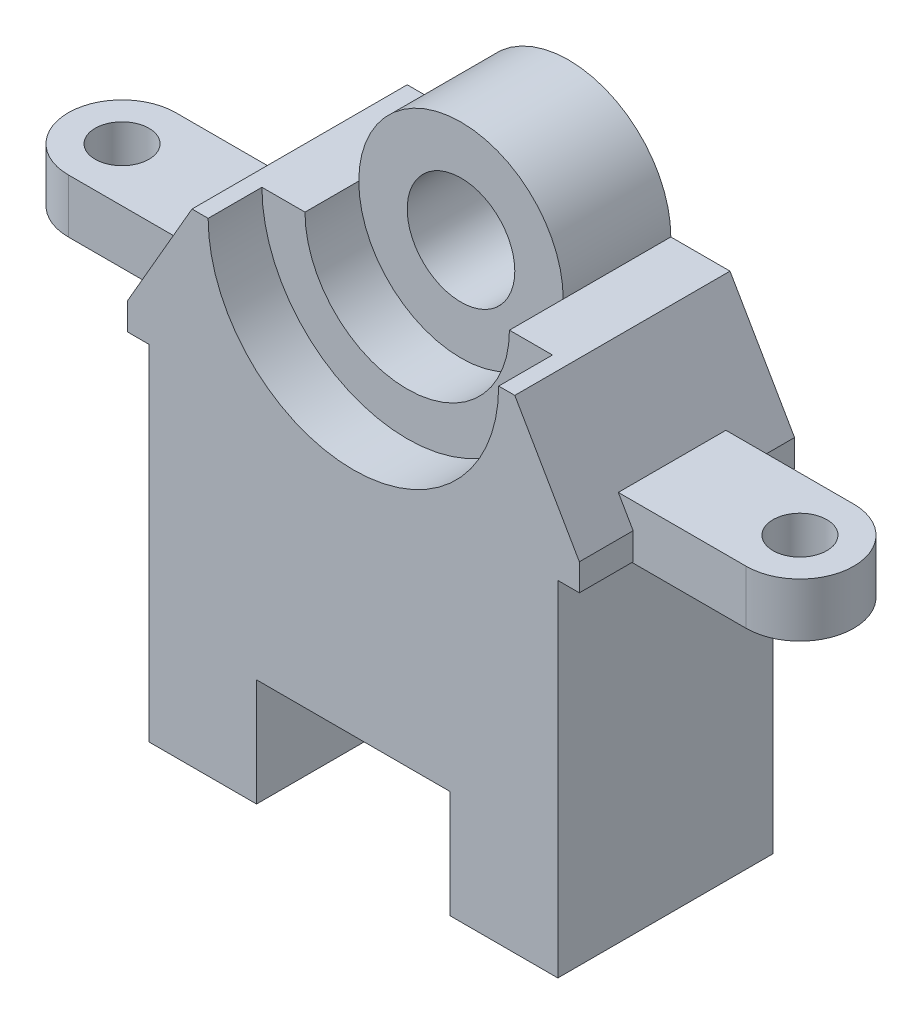
ISO-10303-21;
HEADER;
FILE_DESCRIPTION(('STEP AP214'),'2;1');
FILE_NAME('part.step','',(''),(''),'','','');
FILE_SCHEMA(('AUTOMOTIVE_DESIGN { 1 0 10303 214 1 1 1 1 }'));
ENDSEC;
DATA;
#1=APPLICATION_CONTEXT('core data for automotive mechanical design processes');
#2=APPLICATION_PROTOCOL_DEFINITION('international standard','automotive_design',2000,#1);
#3=PRODUCT_CONTEXT('',#1,'mechanical');
#4=PRODUCT('Part','Part','',(#3));
#5=PRODUCT_RELATED_PRODUCT_CATEGORY('part','',(#4));
#6=PRODUCT_DEFINITION_FORMATION('','',#4);
#7=PRODUCT_DEFINITION_CONTEXT('part definition',#1,'design');
#8=PRODUCT_DEFINITION('design','',#6,#7);
#9=PRODUCT_DEFINITION_SHAPE('','',#8);
#10=(LENGTH_UNIT() NAMED_UNIT(*) SI_UNIT(.MILLI.,.METRE.));
#11=(NAMED_UNIT(*) PLANE_ANGLE_UNIT() SI_UNIT($,.RADIAN.));
#12=(NAMED_UNIT(*) SI_UNIT($,.STERADIAN.) SOLID_ANGLE_UNIT());
#13=UNCERTAINTY_MEASURE_WITH_UNIT(LENGTH_MEASURE(1.E-05),#10,'distance_accuracy_value','');
#14=(GEOMETRIC_REPRESENTATION_CONTEXT(3) GLOBAL_UNCERTAINTY_ASSIGNED_CONTEXT((#13)) GLOBAL_UNIT_ASSIGNED_CONTEXT((#10,
#11,#12)) REPRESENTATION_CONTEXT('',''));
#15=CARTESIAN_POINT('',(0.,0.,0.));
#16=DIRECTION('',(0.,0.,1.));
#17=DIRECTION('',(1.,0.,0.));
#18=AXIS2_PLACEMENT_3D('',#15,#16,#17);
#19=CARTESIAN_POINT('',(-42.,-20.7846096908263,20.));
#20=DIRECTION('',(0.866025403784436,-0.500000000000004,0.));
#21=DIRECTION('',(0.500000000000005,0.866025403784436,0.));
#22=AXIS2_PLACEMENT_3D('',#19,#20,#21);
#23=PLANE('',#22);
#24=DIRECTION('',(0.500000000000005,0.866025403784436,0.));
#25=VECTOR('',#24,1.);
#26=CARTESIAN_POINT('',(-42.,-20.7846096908263,10.));
#27=LINE('',#26,#25);
#28=CARTESIAN_POINT('',(-42.,-20.7846096908263,10.));
#29=VERTEX_POINT('',#28);
#30=CARTESIAN_POINT('',(-39.2376043070341,-16.,10.));
#31=VERTEX_POINT('',#30);
#32=EDGE_CURVE('E293',#29,#31,#27,.T.);
#33=ORIENTED_EDGE('',*,*,#32,.F.);
#34=DIRECTION('',(0.,0.,-1.));
#35=VECTOR('',#34,1.);
#36=CARTESIAN_POINT('',(-42.,-20.7846096908263,20.));
#37=LINE('',#36,#35);
#38=CARTESIAN_POINT('',(-42.,-20.7846096908263,20.));
#39=VERTEX_POINT('',#38);
#40=EDGE_CURVE('E466',#39,#29,#37,.T.);
#41=ORIENTED_EDGE('',*,*,#40,.F.);
#42=DIRECTION('',(-0.500000000000004,-0.866025403784436,0.));
#43=VECTOR('',#42,1.);
#44=CARTESIAN_POINT('',(-42.,-20.7846096908263,20.));
#45=LINE('',#44,#43);
#46=CARTESIAN_POINT('',(-30.,0.,20.));
#47=VERTEX_POINT('',#46);
#48=EDGE_CURVE('E418',#47,#39,#45,.T.);
#49=ORIENTED_EDGE('',*,*,#48,.F.);
#50=DIRECTION('',(0.,0.,-1.));
#51=VECTOR('',#50,1.);
#52=CARTESIAN_POINT('',(-30.,0.,20.));
#53=LINE('',#52,#51);
#54=CARTESIAN_POINT('',(-30.,0.,-20.));
#55=VERTEX_POINT('',#54);
#56=EDGE_CURVE('E469',#47,#55,#53,.T.);
#57=ORIENTED_EDGE('',*,*,#56,.T.);
#58=DIRECTION('',(-0.500000000000004,-0.866025403784436,0.));
#59=VECTOR('',#58,1.);
#60=CARTESIAN_POINT('',(-42.,-20.7846096908263,-20.));
#61=LINE('',#60,#59);
#62=CARTESIAN_POINT('',(-42.,-20.7846096908263,-20.));
#63=VERTEX_POINT('',#62);
#64=EDGE_CURVE('E444',#55,#63,#61,.T.);
#65=ORIENTED_EDGE('',*,*,#64,.T.);
#66=CARTESIAN_POINT('',(-42.,-20.7846096908263,-10.));
#67=VERTEX_POINT('',#66);
#68=EDGE_CURVE('E465',#67,#63,#37,.T.);
#69=ORIENTED_EDGE('',*,*,#68,.F.);
#70=DIRECTION('',(-0.500000000000005,-0.866025403784436,0.));
#71=VECTOR('',#70,1.);
#72=CARTESIAN_POINT('',(-42.,-20.7846096908263,-10.));
#73=LINE('',#72,#71);
#74=CARTESIAN_POINT('',(-39.2376043070341,-16.,-10.));
#75=VERTEX_POINT('',#74);
#76=EDGE_CURVE('E54',#75,#67,#73,.T.);
#77=ORIENTED_EDGE('',*,*,#76,.F.);
#78=DIRECTION('',(0.,0.,1.));
#79=VECTOR('',#78,1.);
#80=CARTESIAN_POINT('',(-39.2376043070341,-16.,20.));
#81=LINE('',#80,#79);
#82=EDGE_CURVE('E11',#75,#31,#81,.T.);
#83=ORIENTED_EDGE('',*,*,#82,.T.);
#84=EDGE_LOOP('',(#33,#41,#49,#57,#65,#69,#77,#83));
#85=FACE_BOUND('',#84,.T.);
#86=ADVANCED_FACE('F35',(#85),#23,.F.);
#87=CARTESIAN_POINT('',(-42.,-25.7846096908263,20.));
#88=DIRECTION('',(1.,0.,0.));
#89=DIRECTION('',(0.,0.,-1.));
#90=AXIS2_PLACEMENT_3D('',#87,#88,#89);
#91=PLANE('',#90);
#92=DIRECTION('',(0.,1.,0.));
#93=VECTOR('',#92,1.);
#94=CARTESIAN_POINT('',(-42.,-25.7846096908263,10.));
#95=LINE('',#94,#93);
#96=CARTESIAN_POINT('',(-42.,-25.7846096908263,10.));
#97=VERTEX_POINT('',#96);
#98=EDGE_CURVE('E290',#97,#29,#95,.T.);
#99=ORIENTED_EDGE('',*,*,#98,.F.);
#100=DIRECTION('',(0.,0.,-1.));
#101=VECTOR('',#100,1.);
#102=CARTESIAN_POINT('',(-42.,-25.7846096908263,20.));
#103=LINE('',#102,#101);
#104=CARTESIAN_POINT('',(-42.,-25.7846096908263,20.));
#105=VERTEX_POINT('',#104);
#106=EDGE_CURVE('E462',#105,#97,#103,.T.);
#107=ORIENTED_EDGE('',*,*,#106,.F.);
#108=DIRECTION('',(0.,-1.,0.));
#109=VECTOR('',#108,1.);
#110=CARTESIAN_POINT('',(-42.,-25.7846096908263,20.));
#111=LINE('',#110,#109);
#112=EDGE_CURVE('E420',#39,#105,#111,.T.);
#113=ORIENTED_EDGE('',*,*,#112,.F.);
#114=ORIENTED_EDGE('',*,*,#40,.T.);
#115=EDGE_LOOP('',(#99,#107,#113,#114));
#116=FACE_BOUND('',#115,.T.);
#117=ADVANCED_FACE('F529',(#116),#91,.F.);
#118=DIRECTION('',(0.,-1.,0.));
#119=VECTOR('',#118,1.);
#120=CARTESIAN_POINT('',(-42.,-25.7846096908263,-10.));
#121=LINE('',#120,#119);
#122=CARTESIAN_POINT('',(-42.,-25.7846096908263,-10.));
#123=VERTEX_POINT('',#122);
#124=EDGE_CURVE('E283',#67,#123,#121,.T.);
#125=ORIENTED_EDGE('',*,*,#124,.F.);
#126=ORIENTED_EDGE('',*,*,#68,.T.);
#127=DIRECTION('',(0.,-1.,0.));
#128=VECTOR('',#127,1.);
#129=CARTESIAN_POINT('',(-42.,-25.7846096908263,-20.));
#130=LINE('',#129,#128);
#131=CARTESIAN_POINT('',(-42.,-25.7846096908263,-20.));
#132=VERTEX_POINT('',#131);
#133=EDGE_CURVE('E447',#63,#132,#130,.T.);
#134=ORIENTED_EDGE('',*,*,#133,.T.);
#135=EDGE_CURVE('E461',#123,#132,#103,.T.);
#136=ORIENTED_EDGE('',*,*,#135,.F.);
#137=EDGE_LOOP('',(#125,#126,#134,#136));
#138=FACE_BOUND('',#137,.T.);
#139=ADVANCED_FACE('F534',(#138),#91,.F.);
#140=CARTESIAN_POINT('',(-38.,-25.7846096908263,20.));
#141=DIRECTION('',(0.,1.,0.));
#142=DIRECTION('',(-1.,0.,0.));
#143=AXIS2_PLACEMENT_3D('',#140,#141,#142);
#144=PLANE('',#143);
#145=DIRECTION('',(-1.,0.,0.));
#146=VECTOR('',#145,1.);
#147=CARTESIAN_POINT('',(-38.,-25.7846096908263,10.));
#148=LINE('',#147,#146);
#149=CARTESIAN_POINT('',(-38.,-25.7846096908263,10.));
#150=VERTEX_POINT('',#149);
#151=EDGE_CURVE('E287',#150,#97,#148,.T.);
#152=ORIENTED_EDGE('',*,*,#151,.F.);
#153=DIRECTION('',(0.,0.,-1.));
#154=VECTOR('',#153,1.);
#155=CARTESIAN_POINT('',(-38.,-25.7846096908263,20.));
#156=LINE('',#155,#154);
#157=CARTESIAN_POINT('',(-38.,-25.7846096908263,20.));
#158=VERTEX_POINT('',#157);
#159=EDGE_CURVE('E458',#158,#150,#156,.T.);
#160=ORIENTED_EDGE('',*,*,#159,.F.);
#161=DIRECTION('',(1.,0.,0.));
#162=VECTOR('',#161,1.);
#163=CARTESIAN_POINT('',(-38.,-25.7846096908263,20.));
#164=LINE('',#163,#162);
#165=EDGE_CURVE('E422',#105,#158,#164,.T.);
#166=ORIENTED_EDGE('',*,*,#165,.F.);
#167=ORIENTED_EDGE('',*,*,#106,.T.);
#168=EDGE_LOOP('',(#152,#160,#166,#167));
#169=FACE_BOUND('',#168,.T.);
#170=ADVANCED_FACE('F670',(#169),#144,.F.);
#171=DIRECTION('',(1.,0.,0.));
#172=VECTOR('',#171,1.);
#173=CARTESIAN_POINT('',(-38.,-25.7846096908263,-10.));
#174=LINE('',#173,#172);
#175=CARTESIAN_POINT('',(-38.,-25.7846096908263,-10.));
#176=VERTEX_POINT('',#175);
#177=EDGE_CURVE('E266',#123,#176,#174,.T.);
#178=ORIENTED_EDGE('',*,*,#177,.F.);
#179=ORIENTED_EDGE('',*,*,#135,.T.);
#180=DIRECTION('',(1.,0.,0.));
#181=VECTOR('',#180,1.);
#182=CARTESIAN_POINT('',(-38.,-25.7846096908263,-20.));
#183=LINE('',#182,#181);
#184=CARTESIAN_POINT('',(-38.,-25.7846096908263,-20.));
#185=VERTEX_POINT('',#184);
#186=EDGE_CURVE('E450',#132,#185,#183,.T.);
#187=ORIENTED_EDGE('',*,*,#186,.T.);
#188=EDGE_CURVE('E457',#176,#185,#156,.T.);
#189=ORIENTED_EDGE('',*,*,#188,.F.);
#190=EDGE_LOOP('',(#178,#179,#187,#189));
#191=FACE_BOUND('',#190,.T.);
#192=ADVANCED_FACE('F669',(#191),#144,.F.);
#193=CARTESIAN_POINT('',(-38.,-89.7846096908263,20.));
#194=DIRECTION('',(1.,0.,0.));
#195=DIRECTION('',(0.,0.,-1.));
#196=AXIS2_PLACEMENT_3D('',#193,#194,#195);
#197=PLANE('',#196);
#198=DIRECTION('',(0.,1.,0.));
#199=VECTOR('',#198,1.);
#200=CARTESIAN_POINT('',(-38.,-89.7846096908263,10.));
#201=LINE('',#200,#199);
#202=CARTESIAN_POINT('',(-38.,-26.,10.));
#203=VERTEX_POINT('',#202);
#204=EDGE_CURVE('E44',#203,#150,#201,.T.);
#205=ORIENTED_EDGE('',*,*,#204,.F.);
#206=DIRECTION('',(0.,0.,1.));
#207=VECTOR('',#206,1.);
#208=CARTESIAN_POINT('',(-38.,-26.,20.));
#209=LINE('',#208,#207);
#210=CARTESIAN_POINT('',(-38.,-26.,-10.));
#211=VERTEX_POINT('',#210);
#212=EDGE_CURVE('E501',#211,#203,#209,.T.);
#213=ORIENTED_EDGE('',*,*,#212,.F.);
#214=DIRECTION('',(0.,-1.,0.));
#215=VECTOR('',#214,1.);
#216=CARTESIAN_POINT('',(-38.,-89.7846096908263,-10.));
#217=LINE('',#216,#215);
#218=EDGE_CURVE('E504',#176,#211,#217,.T.);
#219=ORIENTED_EDGE('',*,*,#218,.F.);
#220=ORIENTED_EDGE('',*,*,#188,.T.);
#221=DIRECTION('',(0.,-1.,0.));
#222=VECTOR('',#221,1.);
#223=CARTESIAN_POINT('',(-38.,-89.7846096908263,-20.));
#224=LINE('',#223,#222);
#225=CARTESIAN_POINT('',(-38.,-89.7846096908263,-20.));
#226=VERTEX_POINT('',#225);
#227=EDGE_CURVE('E453',#185,#226,#224,.T.);
#228=ORIENTED_EDGE('',*,*,#227,.T.);
#229=DIRECTION('',(0.,0.,-1.));
#230=VECTOR('',#229,1.);
#231=CARTESIAN_POINT('',(-38.,-89.7846096908263,20.));
#232=LINE('',#231,#230);
#233=CARTESIAN_POINT('',(-38.,-89.7846096908263,20.));
#234=VERTEX_POINT('',#233);
#235=EDGE_CURVE('E426',#234,#226,#232,.T.);
#236=ORIENTED_EDGE('',*,*,#235,.F.);
#237=DIRECTION('',(0.,-1.,0.));
#238=VECTOR('',#237,1.);
#239=CARTESIAN_POINT('',(-38.,-89.7846096908263,20.));
#240=LINE('',#239,#238);
#241=EDGE_CURVE('E424',#158,#234,#240,.T.);
#242=ORIENTED_EDGE('',*,*,#241,.F.);
#243=ORIENTED_EDGE('',*,*,#159,.T.);
#244=EDGE_LOOP('',(#205,#213,#219,#220,#228,#236,#242,#243));
#245=FACE_BOUND('',#244,.T.);
#246=ADVANCED_FACE('F511',(#245),#197,.F.);
#247=CARTESIAN_POINT('',(38.,-25.7846096908262,20.));
#248=DIRECTION('',(0.,1.,0.));
#249=DIRECTION('',(-1.,0.,0.));
#250=AXIS2_PLACEMENT_3D('',#247,#248,#249);
#251=PLANE('',#250);
#252=DIRECTION('',(0.,0.,-1.));
#253=VECTOR('',#252,1.);
#254=CARTESIAN_POINT('',(38.,-25.7846096908262,20.));
#255=LINE('',#254,#253);
#256=CARTESIAN_POINT('',(38.,-25.7846096908262,20.));
#257=VERTEX_POINT('',#256);
#258=CARTESIAN_POINT('',(38.,-25.7846096908262,10.));
#259=VERTEX_POINT('',#258);
#260=EDGE_CURVE('E484',#257,#259,#255,.T.);
#261=ORIENTED_EDGE('',*,*,#260,.T.);
#262=DIRECTION('',(1.,0.,0.));
#263=VECTOR('',#262,1.);
#264=CARTESIAN_POINT('',(38.,-25.7846096908262,10.));
#265=LINE('',#264,#263);
#266=CARTESIAN_POINT('',(42.,-25.7846096908263,10.));
#267=VERTEX_POINT('',#266);
#268=EDGE_CURVE('E328',#259,#267,#265,.T.);
#269=ORIENTED_EDGE('',*,*,#268,.T.);
#270=DIRECTION('',(0.,0.,-1.));
#271=VECTOR('',#270,1.);
#272=CARTESIAN_POINT('',(42.,-25.7846096908263,20.));
#273=LINE('',#272,#271);
#274=CARTESIAN_POINT('',(42.,-25.7846096908263,20.));
#275=VERTEX_POINT('',#274);
#276=EDGE_CURVE('E480',#275,#267,#273,.T.);
#277=ORIENTED_EDGE('',*,*,#276,.F.);
#278=DIRECTION('',(1.,0.,0.));
#279=VECTOR('',#278,1.);
#280=CARTESIAN_POINT('',(38.,-25.7846096908262,20.));
#281=LINE('',#280,#279);
#282=EDGE_CURVE('E408',#257,#275,#281,.T.);
#283=ORIENTED_EDGE('',*,*,#282,.F.);
#284=EDGE_LOOP('',(#261,#269,#277,#283));
#285=FACE_BOUND('',#284,.T.);
#286=ADVANCED_FACE('F558',(#285),#251,.F.);
#287=CARTESIAN_POINT('',(42.,-25.7846096908263,20.));
#288=DIRECTION('',(-1.,0.,0.));
#289=DIRECTION('',(0.,0.,1.));
#290=AXIS2_PLACEMENT_3D('',#287,#288,#289);
#291=PLANE('',#290);
#292=ORIENTED_EDGE('',*,*,#276,.T.);
#293=DIRECTION('',(0.,1.,0.));
#294=VECTOR('',#293,1.);
#295=CARTESIAN_POINT('',(42.,-25.7846096908263,10.));
#296=LINE('',#295,#294);
#297=CARTESIAN_POINT('',(42.,-20.7846096908263,10.));
#298=VERTEX_POINT('',#297);
#299=EDGE_CURVE('E325',#267,#298,#296,.T.);
#300=ORIENTED_EDGE('',*,*,#299,.T.);
#301=DIRECTION('',(0.,0.,-1.));
#302=VECTOR('',#301,1.);
#303=CARTESIAN_POINT('',(42.,-20.7846096908263,20.));
#304=LINE('',#303,#302);
#305=CARTESIAN_POINT('',(42.,-20.7846096908263,20.));
#306=VERTEX_POINT('',#305);
#307=EDGE_CURVE('E476',#306,#298,#304,.T.);
#308=ORIENTED_EDGE('',*,*,#307,.F.);
#309=DIRECTION('',(0.,1.,0.));
#310=VECTOR('',#309,1.);
#311=CARTESIAN_POINT('',(42.,-25.7846096908263,20.));
#312=LINE('',#311,#310);
#313=EDGE_CURVE('E410',#275,#306,#312,.T.);
#314=ORIENTED_EDGE('',*,*,#313,.F.);
#315=EDGE_LOOP('',(#292,#300,#308,#314));
#316=FACE_BOUND('',#315,.T.);
#317=ADVANCED_FACE('F554',(#316),#291,.F.);
#318=CARTESIAN_POINT('',(-30.,0.,20.));
#319=DIRECTION('',(0.,-1.,0.));
#320=DIRECTION('',(1.,0.,0.));
#321=AXIS2_PLACEMENT_3D('',#318,#319,#320);
#322=PLANE('',#321);
#323=DIRECTION('',(-1.,0.,0.));
#324=VECTOR('',#323,1.);
#325=CARTESIAN_POINT('',(-30.,0.,-20.));
#326=LINE('',#325,#324);
#327=CARTESIAN_POINT('',(30.,0.,-20.));
#328=VERTEX_POINT('',#327);
#329=CARTESIAN_POINT('',(19.,0.,-20.));
#330=VERTEX_POINT('',#329);
#331=EDGE_CURVE('E442',#328,#330,#326,.T.);
#332=ORIENTED_EDGE('',*,*,#331,.T.);
#333=DIRECTION('',(0.,0.,1.));
#334=VECTOR('',#333,1.);
#335=CARTESIAN_POINT('',(19.,0.,-73.7401153701776));
#336=LINE('',#335,#334);
#337=CARTESIAN_POINT('',(19.,0.,0.));
#338=VERTEX_POINT('',#337);
#339=EDGE_CURVE('E349',#330,#338,#336,.T.);
#340=ORIENTED_EDGE('',*,*,#339,.T.);
#341=DIRECTION('',(0.,0.,1.));
#342=VECTOR('',#341,1.);
#343=CARTESIAN_POINT('',(19.,0.,0.));
#344=LINE('',#343,#342);
#345=CARTESIAN_POINT('',(19.,0.,10.));
#346=VERTEX_POINT('',#345);
#347=EDGE_CURVE('E358',#338,#346,#344,.T.);
#348=ORIENTED_EDGE('',*,*,#347,.T.);
#349=DIRECTION('',(1.,0.,0.));
#350=VECTOR('',#349,1.);
#351=CARTESIAN_POINT('',(-27.,0.,10.));
#352=LINE('',#351,#350);
#353=CARTESIAN_POINT('',(27.,0.,10.));
#354=VERTEX_POINT('',#353);
#355=EDGE_CURVE('E365',#346,#354,#352,.T.);
#356=ORIENTED_EDGE('',*,*,#355,.T.);
#357=DIRECTION('',(0.,0.,1.));
#358=VECTOR('',#357,1.);
#359=CARTESIAN_POINT('',(27.,0.,10.));
#360=LINE('',#359,#358);
#361=CARTESIAN_POINT('',(27.,0.,20.));
#362=VERTEX_POINT('',#361);
#363=EDGE_CURVE('E369',#354,#362,#360,.T.);
#364=ORIENTED_EDGE('',*,*,#363,.T.);
#365=DIRECTION('',(-1.,0.,0.));
#366=VECTOR('',#365,1.);
#367=CARTESIAN_POINT('',(-30.,0.,20.));
#368=LINE('',#367,#366);
#369=CARTESIAN_POINT('',(30.,0.,20.));
#370=VERTEX_POINT('',#369);
#371=EDGE_CURVE('E415',#370,#362,#368,.T.);
#372=ORIENTED_EDGE('',*,*,#371,.F.);
#373=DIRECTION('',(0.,0.,-1.));
#374=VECTOR('',#373,1.);
#375=CARTESIAN_POINT('',(30.,0.,20.));
#376=LINE('',#375,#374);
#377=EDGE_CURVE('E472',#370,#328,#376,.T.);
#378=ORIENTED_EDGE('',*,*,#377,.T.);
#379=EDGE_LOOP('',(#332,#340,#348,#356,#364,#372,#378));
#380=FACE_BOUND('',#379,.T.);
#381=ADVANCED_FACE('F545',(#380),#322,.F.);
#382=CARTESIAN_POINT('',(-38.,-89.7846096908263,20.));
#383=DIRECTION('',(0.,1.,0.));
#384=DIRECTION('',(0.,0.,1.));
#385=AXIS2_PLACEMENT_3D('',#382,#383,#384);
#386=PLANE('',#385);
#387=DIRECTION('',(1.,0.,0.));
#388=VECTOR('',#387,1.);
#389=CARTESIAN_POINT('',(-38.,-89.7846096908263,-20.));
#390=LINE('',#389,#388);
#391=CARTESIAN_POINT('',(-18.,-89.7846096908263,-20.));
#392=VERTEX_POINT('',#391);
#393=EDGE_CURVE('E427',#226,#392,#390,.T.);
#394=ORIENTED_EDGE('',*,*,#393,.T.);
#395=DIRECTION('',(0.,0.,1.));
#396=VECTOR('',#395,1.);
#397=CARTESIAN_POINT('',(-18.,-89.7846096908263,-20.));
#398=LINE('',#397,#396);
#399=CARTESIAN_POINT('',(-18.,-89.7846096908263,20.));
#400=VERTEX_POINT('',#399);
#401=EDGE_CURVE('E386',#392,#400,#398,.T.);
#402=ORIENTED_EDGE('',*,*,#401,.T.);
#403=DIRECTION('',(1.,0.,0.));
#404=VECTOR('',#403,1.);
#405=CARTESIAN_POINT('',(-38.,-89.7846096908263,20.));
#406=LINE('',#405,#404);
#407=EDGE_CURVE('E402',#234,#400,#406,.T.);
#408=ORIENTED_EDGE('',*,*,#407,.F.);
#409=ORIENTED_EDGE('',*,*,#235,.T.);
#410=EDGE_LOOP('',(#394,#402,#408,#409));
#411=FACE_BOUND('',#410,.T.);
#412=ADVANCED_FACE('F564',(#411),#386,.F.);
#413=CARTESIAN_POINT('',(18.,-89.7846096908263,20.));
#414=VERTEX_POINT('',#413);
#415=CARTESIAN_POINT('',(38.,-89.7846096908263,20.));
#416=VERTEX_POINT('',#415);
#417=EDGE_CURVE('E406',#414,#416,#406,.T.);
#418=ORIENTED_EDGE('',*,*,#417,.F.);
#419=DIRECTION('',(0.,0.,1.));
#420=VECTOR('',#419,1.);
#421=CARTESIAN_POINT('',(18.,-89.7846096908263,-20.));
#422=LINE('',#421,#420);
#423=CARTESIAN_POINT('',(18.,-89.7846096908263,-20.));
#424=VERTEX_POINT('',#423);
#425=EDGE_CURVE('E398',#424,#414,#422,.T.);
#426=ORIENTED_EDGE('',*,*,#425,.F.);
#427=CARTESIAN_POINT('',(38.,-89.7846096908263,-20.));
#428=VERTEX_POINT('',#427);
#429=EDGE_CURVE('E395',#424,#428,#390,.T.);
#430=ORIENTED_EDGE('',*,*,#429,.T.);
#431=DIRECTION('',(0.,0.,-1.));
#432=VECTOR('',#431,1.);
#433=CARTESIAN_POINT('',(38.,-89.7846096908263,20.));
#434=LINE('',#433,#432);
#435=EDGE_CURVE('E487',#416,#428,#434,.T.);
#436=ORIENTED_EDGE('',*,*,#435,.F.);
#437=EDGE_LOOP('',(#418,#426,#430,#436));
#438=FACE_BOUND('',#437,.T.);
#439=ADVANCED_FACE('F37',(#438),#386,.F.);
#440=CARTESIAN_POINT('',(38.,-89.7846096908263,20.));
#441=DIRECTION('',(-1.,0.,0.));
#442=DIRECTION('',(0.,-1.,0.));
#443=AXIS2_PLACEMENT_3D('',#440,#441,#442);
#444=PLANE('',#443);
#445=DIRECTION('',(0.,0.,-1.));
#446=VECTOR('',#445,1.);
#447=CARTESIAN_POINT('',(38.,-26.,20.));
#448=LINE('',#447,#446);
#449=CARTESIAN_POINT('',(38.,-26.,10.));
#450=VERTEX_POINT('',#449);
#451=CARTESIAN_POINT('',(38.,-26.,-10.));
#452=VERTEX_POINT('',#451);
#453=EDGE_CURVE('E499',#450,#452,#448,.T.);
#454=ORIENTED_EDGE('',*,*,#453,.F.);
#455=DIRECTION('',(0.,1.,0.));
#456=VECTOR('',#455,1.);
#457=CARTESIAN_POINT('',(38.,-89.7846096908263,10.));
#458=LINE('',#457,#456);
#459=EDGE_CURVE('E331',#450,#259,#458,.T.);
#460=ORIENTED_EDGE('',*,*,#459,.T.);
#461=ORIENTED_EDGE('',*,*,#260,.F.);
#462=DIRECTION('',(0.,1.,0.));
#463=VECTOR('',#462,1.);
#464=CARTESIAN_POINT('',(38.,-89.7846096908263,20.));
#465=LINE('',#464,#463);
#466=EDGE_CURVE('E405',#416,#257,#465,.T.);
#467=ORIENTED_EDGE('',*,*,#466,.F.);
#468=ORIENTED_EDGE('',*,*,#435,.T.);
#469=DIRECTION('',(0.,1.,0.));
#470=VECTOR('',#469,1.);
#471=CARTESIAN_POINT('',(38.,-89.7846096908263,-20.));
#472=LINE('',#471,#470);
#473=CARTESIAN_POINT('',(38.,-25.7846096908262,-20.));
#474=VERTEX_POINT('',#473);
#475=EDGE_CURVE('E430',#428,#474,#472,.T.);
#476=ORIENTED_EDGE('',*,*,#475,.T.);
#477=CARTESIAN_POINT('',(38.,-25.7846096908262,-10.));
#478=VERTEX_POINT('',#477);
#479=EDGE_CURVE('E483',#478,#474,#255,.T.);
#480=ORIENTED_EDGE('',*,*,#479,.F.);
#481=DIRECTION('',(0.,-1.,0.));
#482=VECTOR('',#481,1.);
#483=CARTESIAN_POINT('',(38.,-89.7846096908263,-10.));
#484=LINE('',#483,#482);
#485=EDGE_CURVE('E322',#478,#452,#484,.T.);
#486=ORIENTED_EDGE('',*,*,#485,.T.);
#487=EDGE_LOOP('',(#454,#460,#461,#467,#468,#476,#480,#486));
#488=FACE_BOUND('',#487,.T.);
#489=ADVANCED_FACE('F556',(#488),#444,.F.);
#490=CARTESIAN_POINT('',(42.,-25.7846096908263,-10.));
#491=VERTEX_POINT('',#490);
#492=CARTESIAN_POINT('',(42.,-25.7846096908263,-20.));
#493=VERTEX_POINT('',#492);
#494=EDGE_CURVE('E479',#491,#493,#273,.T.);
#495=ORIENTED_EDGE('',*,*,#494,.F.);
#496=DIRECTION('',(-1.,0.,0.));
#497=VECTOR('',#496,1.);
#498=CARTESIAN_POINT('',(38.,-25.7846096908262,-10.));
#499=LINE('',#498,#497);
#500=EDGE_CURVE('E319',#491,#478,#499,.T.);
#501=ORIENTED_EDGE('',*,*,#500,.T.);
#502=ORIENTED_EDGE('',*,*,#479,.T.);
#503=DIRECTION('',(1.,0.,0.));
#504=VECTOR('',#503,1.);
#505=CARTESIAN_POINT('',(38.,-25.7846096908262,-20.));
#506=LINE('',#505,#504);
#507=EDGE_CURVE('E433',#474,#493,#506,.T.);
#508=ORIENTED_EDGE('',*,*,#507,.T.);
#509=EDGE_LOOP('',(#495,#501,#502,#508));
#510=FACE_BOUND('',#509,.T.);
#511=ADVANCED_FACE('F552',(#510),#251,.F.);
#512=CARTESIAN_POINT('',(42.,-20.7846096908263,-10.));
#513=VERTEX_POINT('',#512);
#514=CARTESIAN_POINT('',(42.,-20.7846096908263,-20.));
#515=VERTEX_POINT('',#514);
#516=EDGE_CURVE('E475',#513,#515,#304,.T.);
#517=ORIENTED_EDGE('',*,*,#516,.F.);
#518=DIRECTION('',(0.,-1.,0.));
#519=VECTOR('',#518,1.);
#520=CARTESIAN_POINT('',(42.,-25.7846096908263,-10.));
#521=LINE('',#520,#519);
#522=EDGE_CURVE('E316',#513,#491,#521,.T.);
#523=ORIENTED_EDGE('',*,*,#522,.T.);
#524=ORIENTED_EDGE('',*,*,#494,.T.);
#525=DIRECTION('',(0.,1.,0.));
#526=VECTOR('',#525,1.);
#527=CARTESIAN_POINT('',(42.,-25.7846096908263,-20.));
#528=LINE('',#527,#526);
#529=EDGE_CURVE('E436',#493,#515,#528,.T.);
#530=ORIENTED_EDGE('',*,*,#529,.T.);
#531=EDGE_LOOP('',(#517,#523,#524,#530));
#532=FACE_BOUND('',#531,.T.);
#533=ADVANCED_FACE('F548',(#532),#291,.F.);
#534=CARTESIAN_POINT('',(42.,-20.7846096908263,20.));
#535=DIRECTION('',(-0.866025403784436,-0.500000000000004,0.));
#536=DIRECTION('',(0.500000000000004,-0.866025403784436,0.));
#537=AXIS2_PLACEMENT_3D('',#534,#535,#536);
#538=PLANE('',#537);
#539=ORIENTED_EDGE('',*,*,#307,.T.);
#540=DIRECTION('',(-0.500000000000004,0.866025403784436,0.));
#541=VECTOR('',#540,1.);
#542=CARTESIAN_POINT('',(42.,-20.7846096908263,10.));
#543=LINE('',#542,#541);
#544=CARTESIAN_POINT('',(39.2376043070341,-16.,10.));
#545=VERTEX_POINT('',#544);
#546=EDGE_CURVE('E496',#298,#545,#543,.T.);
#547=ORIENTED_EDGE('',*,*,#546,.T.);
#548=DIRECTION('',(0.,0.,-1.));
#549=VECTOR('',#548,1.);
#550=CARTESIAN_POINT('',(39.2376043070341,-16.,20.));
#551=LINE('',#550,#549);
#552=CARTESIAN_POINT('',(39.2376043070341,-16.,-10.));
#553=VERTEX_POINT('',#552);
#554=EDGE_CURVE('E490',#545,#553,#551,.T.);
#555=ORIENTED_EDGE('',*,*,#554,.T.);
#556=DIRECTION('',(0.500000000000004,-0.866025403784436,0.));
#557=VECTOR('',#556,1.);
#558=CARTESIAN_POINT('',(42.,-20.7846096908263,-10.));
#559=LINE('',#558,#557);
#560=EDGE_CURVE('E493',#553,#513,#559,.T.);
#561=ORIENTED_EDGE('',*,*,#560,.T.);
#562=ORIENTED_EDGE('',*,*,#516,.T.);
#563=DIRECTION('',(-0.500000000000004,0.866025403784436,0.));
#564=VECTOR('',#563,1.);
#565=CARTESIAN_POINT('',(42.,-20.7846096908263,-20.));
#566=LINE('',#565,#564);
#567=EDGE_CURVE('E439',#515,#328,#566,.T.);
#568=ORIENTED_EDGE('',*,*,#567,.T.);
#569=ORIENTED_EDGE('',*,*,#377,.F.);
#570=DIRECTION('',(-0.500000000000004,0.866025403784436,0.));
#571=VECTOR('',#570,1.);
#572=CARTESIAN_POINT('',(42.,-20.7846096908263,20.));
#573=LINE('',#572,#571);
#574=EDGE_CURVE('E412',#306,#370,#573,.T.);
#575=ORIENTED_EDGE('',*,*,#574,.F.);
#576=EDGE_LOOP('',(#539,#547,#555,#561,#562,#568,#569,#575));
#577=FACE_BOUND('',#576,.T.);
#578=ADVANCED_FACE('F543',(#577),#538,.F.);
#579=DIRECTION('',(0.,0.,1.));
#580=VECTOR('',#579,1.);
#581=CARTESIAN_POINT('',(-19.,0.,0.));
#582=LINE('',#581,#580);
#583=CARTESIAN_POINT('',(-19.,0.,0.));
#584=VERTEX_POINT('',#583);
#585=CARTESIAN_POINT('',(-19.,0.,10.));
#586=VERTEX_POINT('',#585);
#587=EDGE_CURVE('E355',#584,#586,#582,.T.);
#588=ORIENTED_EDGE('',*,*,#587,.F.);
#589=DIRECTION('',(0.,0.,1.));
#590=VECTOR('',#589,1.);
#591=CARTESIAN_POINT('',(-19.,0.,-73.7401153701776));
#592=LINE('',#591,#590);
#593=CARTESIAN_POINT('',(-19.,0.,-20.));
#594=VERTEX_POINT('',#593);
#595=EDGE_CURVE('E346',#584,#594,#592,.F.);
#596=ORIENTED_EDGE('',*,*,#595,.T.);
#597=EDGE_CURVE('E441',#594,#55,#326,.T.);
#598=ORIENTED_EDGE('',*,*,#597,.T.);
#599=ORIENTED_EDGE('',*,*,#56,.F.);
#600=CARTESIAN_POINT('',(-27.,0.,20.));
#601=VERTEX_POINT('',#600);
#602=EDGE_CURVE('E414',#601,#47,#368,.T.);
#603=ORIENTED_EDGE('',*,*,#602,.F.);
#604=DIRECTION('',(0.,0.,1.));
#605=VECTOR('',#604,1.);
#606=CARTESIAN_POINT('',(-27.,0.,10.));
#607=LINE('',#606,#605);
#608=CARTESIAN_POINT('',(-27.,0.,10.));
#609=VERTEX_POINT('',#608);
#610=EDGE_CURVE('E371',#609,#601,#607,.T.);
#611=ORIENTED_EDGE('',*,*,#610,.F.);
#612=EDGE_CURVE('E366',#609,#586,#352,.T.);
#613=ORIENTED_EDGE('',*,*,#612,.T.);
#614=EDGE_LOOP('',(#588,#596,#598,#599,#603,#611,#613));
#615=FACE_BOUND('',#614,.T.);
#616=ADVANCED_FACE('F539',(#615),#322,.F.);
#617=CARTESIAN_POINT('',(0.,0.,20.));
#618=DIRECTION('',(0.,0.,1.));
#619=DIRECTION('',(1.,0.,0.));
#620=AXIS2_PLACEMENT_3D('',#617,#618,#619);
#621=PLANE('',#620);
#622=CARTESIAN_POINT('',(0.,0.,20.));
#623=DIRECTION('',(0.,0.,1.));
#624=DIRECTION('',(1.,0.,0.));
#625=AXIS2_PLACEMENT_3D('',#622,#623,#624);
#626=CIRCLE('',#625,27.);
#627=EDGE_CURVE('E361',#601,#362,#626,.T.);
#628=ORIENTED_EDGE('',*,*,#627,.F.);
#629=ORIENTED_EDGE('',*,*,#602,.T.);
#630=ORIENTED_EDGE('',*,*,#48,.T.);
#631=ORIENTED_EDGE('',*,*,#112,.T.);
#632=ORIENTED_EDGE('',*,*,#165,.T.);
#633=ORIENTED_EDGE('',*,*,#241,.T.);
#634=ORIENTED_EDGE('',*,*,#407,.T.);
#635=DIRECTION('',(0.,-1.,0.));
#636=VECTOR('',#635,1.);
#637=CARTESIAN_POINT('',(-18.,-89.7846096908263,20.));
#638=LINE('',#637,#636);
#639=CARTESIAN_POINT('',(-18.,-69.7846096908263,20.));
#640=VERTEX_POINT('',#639);
#641=EDGE_CURVE('E373',#640,#400,#638,.T.);
#642=ORIENTED_EDGE('',*,*,#641,.F.);
#643=DIRECTION('',(-1.,0.,0.));
#644=VECTOR('',#643,1.);
#645=CARTESIAN_POINT('',(-18.,-69.7846096908263,20.));
#646=LINE('',#645,#644);
#647=CARTESIAN_POINT('',(18.,-69.7846096908263,20.));
#648=VERTEX_POINT('',#647);
#649=EDGE_CURVE('E380',#648,#640,#646,.T.);
#650=ORIENTED_EDGE('',*,*,#649,.F.);
#651=DIRECTION('',(0.,1.,0.));
#652=VECTOR('',#651,1.);
#653=CARTESIAN_POINT('',(18.,-89.7846096908263,20.));
#654=LINE('',#653,#652);
#655=EDGE_CURVE('E388',#414,#648,#654,.T.);
#656=ORIENTED_EDGE('',*,*,#655,.F.);
#657=ORIENTED_EDGE('',*,*,#417,.T.);
#658=ORIENTED_EDGE('',*,*,#466,.T.);
#659=ORIENTED_EDGE('',*,*,#282,.T.);
#660=ORIENTED_EDGE('',*,*,#313,.T.);
#661=ORIENTED_EDGE('',*,*,#574,.T.);
#662=ORIENTED_EDGE('',*,*,#371,.T.);
#663=EDGE_LOOP('',(#628,#629,#630,#631,#632,#633,#634,#642,#650,#656,#657,#658,#659,#660,#661,#662));
#664=FACE_BOUND('',#663,.T.);
#665=ADVANCED_FACE('F542',(#664),#621,.T.);
#666=CARTESIAN_POINT('',(0.,0.,-20.));
#667=DIRECTION('',(0.,0.,1.));
#668=DIRECTION('',(1.,0.,0.));
#669=AXIS2_PLACEMENT_3D('',#666,#667,#668);
#670=PLANE('',#669);
#671=CARTESIAN_POINT('',(0.,0.,-20.));
#672=DIRECTION('',(0.,0.,1.));
#673=DIRECTION('',(1.,0.,0.));
#674=AXIS2_PLACEMENT_3D('',#671,#672,#673);
#675=CIRCLE('',#674,10.);
#676=CARTESIAN_POINT('',(10.,0.,-20.));
#677=VERTEX_POINT('',#676);
#678=EDGE_CURVE('E338',#677,#677,#675,.F.);
#679=ORIENTED_EDGE('',*,*,#678,.F.);
#680=EDGE_LOOP('',(#679));
#681=FACE_BOUND('',#680,.T.);
#682=ORIENTED_EDGE('',*,*,#597,.F.);
#683=CARTESIAN_POINT('',(0.,0.,-20.));
#684=DIRECTION('',(0.,0.,1.));
#685=DIRECTION('',(1.,0.,0.));
#686=AXIS2_PLACEMENT_3D('',#683,#684,#685);
#687=CIRCLE('',#686,19.);
#688=EDGE_CURVE('E335',#594,#330,#687,.F.);
#689=ORIENTED_EDGE('',*,*,#688,.T.);
#690=ORIENTED_EDGE('',*,*,#331,.F.);
#691=ORIENTED_EDGE('',*,*,#567,.F.);
#692=ORIENTED_EDGE('',*,*,#529,.F.);
#693=ORIENTED_EDGE('',*,*,#507,.F.);
#694=ORIENTED_EDGE('',*,*,#475,.F.);
#695=ORIENTED_EDGE('',*,*,#429,.F.);
#696=DIRECTION('',(0.,1.,0.));
#697=VECTOR('',#696,1.);
#698=CARTESIAN_POINT('',(18.,-89.7846096908263,-20.));
#699=LINE('',#698,#697);
#700=CARTESIAN_POINT('',(18.,-69.7846096908263,-20.));
#701=VERTEX_POINT('',#700);
#702=EDGE_CURVE('E379',#424,#701,#699,.T.);
#703=ORIENTED_EDGE('',*,*,#702,.T.);
#704=DIRECTION('',(-1.,0.,0.));
#705=VECTOR('',#704,1.);
#706=CARTESIAN_POINT('',(-18.,-69.7846096908263,-20.));
#707=LINE('',#706,#705);
#708=CARTESIAN_POINT('',(-18.,-69.7846096908263,-20.));
#709=VERTEX_POINT('',#708);
#710=EDGE_CURVE('E383',#701,#709,#707,.T.);
#711=ORIENTED_EDGE('',*,*,#710,.T.);
#712=DIRECTION('',(0.,-1.,0.));
#713=VECTOR('',#712,1.);
#714=CARTESIAN_POINT('',(-18.,-89.7846096908263,-20.));
#715=LINE('',#714,#713);
#716=EDGE_CURVE('E376',#709,#392,#715,.T.);
#717=ORIENTED_EDGE('',*,*,#716,.T.);
#718=ORIENTED_EDGE('',*,*,#393,.F.);
#719=ORIENTED_EDGE('',*,*,#227,.F.);
#720=ORIENTED_EDGE('',*,*,#186,.F.);
#721=ORIENTED_EDGE('',*,*,#133,.F.);
#722=ORIENTED_EDGE('',*,*,#64,.F.);
#723=EDGE_LOOP('',(#682,#689,#690,#691,#692,#693,#694,#695,#703,#711,#717,#718,#719,#720,#721,#722));
#724=FACE_BOUND('',#723,.T.);
#725=ADVANCED_FACE('F602',(#681,#724),#670,.F.);
#726=CARTESIAN_POINT('',(-18.,-89.7846096908263,-20.));
#727=DIRECTION('',(-1.,0.,0.));
#728=DIRECTION('',(0.,0.,1.));
#729=AXIS2_PLACEMENT_3D('',#726,#727,#728);
#730=PLANE('',#729);
#731=ORIENTED_EDGE('',*,*,#641,.T.);
#732=ORIENTED_EDGE('',*,*,#401,.F.);
#733=ORIENTED_EDGE('',*,*,#716,.F.);
#734=DIRECTION('',(0.,0.,1.));
#735=VECTOR('',#734,1.);
#736=CARTESIAN_POINT('',(-18.,-69.7846096908263,-20.));
#737=LINE('',#736,#735);
#738=EDGE_CURVE('E393',#709,#640,#737,.T.);
#739=ORIENTED_EDGE('',*,*,#738,.T.);
#740=EDGE_LOOP('',(#731,#732,#733,#739));
#741=FACE_BOUND('',#740,.T.);
#742=ADVANCED_FACE('F655',(#741),#730,.F.);
#743=CARTESIAN_POINT('',(-18.,-69.7846096908263,-20.));
#744=DIRECTION('',(0.,1.,0.));
#745=DIRECTION('',(0.,0.,1.));
#746=AXIS2_PLACEMENT_3D('',#743,#744,#745);
#747=PLANE('',#746);
#748=ORIENTED_EDGE('',*,*,#649,.T.);
#749=ORIENTED_EDGE('',*,*,#738,.F.);
#750=ORIENTED_EDGE('',*,*,#710,.F.);
#751=DIRECTION('',(0.,0.,1.));
#752=VECTOR('',#751,1.);
#753=CARTESIAN_POINT('',(18.,-69.7846096908263,-20.));
#754=LINE('',#753,#752);
#755=EDGE_CURVE('E396',#701,#648,#754,.T.);
#756=ORIENTED_EDGE('',*,*,#755,.T.);
#757=EDGE_LOOP('',(#748,#749,#750,#756));
#758=FACE_BOUND('',#757,.T.);
#759=ADVANCED_FACE('F652',(#758),#747,.F.);
#760=CARTESIAN_POINT('',(18.,-89.7846096908263,-20.));
#761=DIRECTION('',(1.,0.,0.));
#762=DIRECTION('',(0.,0.,-1.));
#763=AXIS2_PLACEMENT_3D('',#760,#761,#762);
#764=PLANE('',#763);
#765=ORIENTED_EDGE('',*,*,#655,.T.);
#766=ORIENTED_EDGE('',*,*,#755,.F.);
#767=ORIENTED_EDGE('',*,*,#702,.F.);
#768=ORIENTED_EDGE('',*,*,#425,.T.);
#769=EDGE_LOOP('',(#765,#766,#767,#768));
#770=FACE_BOUND('',#769,.T.);
#771=ADVANCED_FACE('F650',(#770),#764,.F.);
#772=CARTESIAN_POINT('',(0.,0.,10.));
#773=DIRECTION('',(0.,0.,1.));
#774=DIRECTION('',(1.,0.,0.));
#775=AXIS2_PLACEMENT_3D('',#772,#773,#774);
#776=CYLINDRICAL_SURFACE('',#775,27.);
#777=ORIENTED_EDGE('',*,*,#627,.T.);
#778=ORIENTED_EDGE('',*,*,#363,.F.);
#779=CARTESIAN_POINT('',(0.,0.,10.));
#780=DIRECTION('',(0.,0.,1.));
#781=DIRECTION('',(1.,0.,0.));
#782=AXIS2_PLACEMENT_3D('',#779,#780,#781);
#783=CIRCLE('',#782,27.);
#784=EDGE_CURVE('E362',#609,#354,#783,.T.);
#785=ORIENTED_EDGE('',*,*,#784,.F.);
#786=ORIENTED_EDGE('',*,*,#610,.T.);
#787=EDGE_LOOP('',(#777,#778,#785,#786));
#788=FACE_BOUND('',#787,.T.);
#789=ADVANCED_FACE('F646',(#788),#776,.F.);
#790=CARTESIAN_POINT('',(0.,0.,10.));
#791=DIRECTION('',(0.,0.,1.));
#792=DIRECTION('',(1.,0.,0.));
#793=AXIS2_PLACEMENT_3D('',#790,#791,#792);
#794=PLANE('',#793);
#795=CARTESIAN_POINT('',(0.,0.,10.));
#796=DIRECTION('',(0.,0.,1.));
#797=DIRECTION('',(1.,0.,0.));
#798=AXIS2_PLACEMENT_3D('',#795,#796,#797);
#799=CIRCLE('',#798,19.);
#800=EDGE_CURVE('E351',#586,#346,#799,.T.);
#801=ORIENTED_EDGE('',*,*,#800,.F.);
#802=ORIENTED_EDGE('',*,*,#612,.F.);
#803=ORIENTED_EDGE('',*,*,#784,.T.);
#804=ORIENTED_EDGE('',*,*,#355,.F.);
#805=EDGE_LOOP('',(#801,#802,#803,#804));
#806=FACE_BOUND('',#805,.T.);
#807=ADVANCED_FACE('F642',(#806),#794,.T.);
#808=CARTESIAN_POINT('',(0.,0.,0.));
#809=DIRECTION('',(0.,0.,1.));
#810=DIRECTION('',(1.,0.,0.));
#811=AXIS2_PLACEMENT_3D('',#808,#809,#810);
#812=CYLINDRICAL_SURFACE('',#811,19.);
#813=ORIENTED_EDGE('',*,*,#800,.T.);
#814=ORIENTED_EDGE('',*,*,#347,.F.);
#815=CARTESIAN_POINT('',(0.,0.,0.));
#816=DIRECTION('',(0.,0.,1.));
#817=DIRECTION('',(1.,0.,0.));
#818=AXIS2_PLACEMENT_3D('',#815,#816,#817);
#819=CIRCLE('',#818,19.);
#820=EDGE_CURVE('E352',#584,#338,#819,.T.);
#821=ORIENTED_EDGE('',*,*,#820,.F.);
#822=ORIENTED_EDGE('',*,*,#587,.T.);
#823=EDGE_LOOP('',(#813,#814,#821,#822));
#824=FACE_BOUND('',#823,.T.);
#825=ADVANCED_FACE('F638',(#824),#812,.F.);
#826=CARTESIAN_POINT('',(0.,0.,0.));
#827=DIRECTION('',(0.,0.,1.));
#828=DIRECTION('',(1.,0.,0.));
#829=AXIS2_PLACEMENT_3D('',#826,#827,#828);
#830=PLANE('',#829);
#831=CARTESIAN_POINT('',(0.,0.,0.));
#832=DIRECTION('',(0.,0.,1.));
#833=DIRECTION('',(1.,0.,0.));
#834=AXIS2_PLACEMENT_3D('',#831,#832,#833);
#835=CIRCLE('',#834,10.);
#836=CARTESIAN_POINT('',(10.,0.,0.));
#837=VERTEX_POINT('',#836);
#838=EDGE_CURVE('E334',#837,#837,#835,.T.);
#839=ORIENTED_EDGE('',*,*,#838,.F.);
#840=EDGE_LOOP('',(#839));
#841=FACE_BOUND('',#840,.T.);
#842=ORIENTED_EDGE('',*,*,#820,.T.);
#843=CARTESIAN_POINT('',(0.,0.,0.));
#844=DIRECTION('',(0.,0.,1.));
#845=DIRECTION('',(1.,0.,0.));
#846=AXIS2_PLACEMENT_3D('',#843,#844,#845);
#847=CIRCLE('',#846,19.);
#848=EDGE_CURVE('E339',#338,#584,#847,.T.);
#849=ORIENTED_EDGE('',*,*,#848,.T.);
#850=EDGE_LOOP('',(#842,#849));
#851=FACE_BOUND('',#850,.T.);
#852=ADVANCED_FACE('F634',(#841,#851),#830,.T.);
#853=CARTESIAN_POINT('',(0.,0.,-73.7401153701776));
#854=DIRECTION('',(0.,0.,1.));
#855=DIRECTION('',(1.,0.,0.));
#856=AXIS2_PLACEMENT_3D('',#853,#854,#855);
#857=CYLINDRICAL_SURFACE('',#856,19.);
#858=ORIENTED_EDGE('',*,*,#339,.F.);
#859=ORIENTED_EDGE('',*,*,#688,.F.);
#860=ORIENTED_EDGE('',*,*,#595,.F.);
#861=ORIENTED_EDGE('',*,*,#848,.F.);
#862=EDGE_LOOP('',(#858,#859,#860,#861));
#863=FACE_BOUND('',#862,.T.);
#864=ADVANCED_FACE('F630',(#863),#857,.T.);
#865=CARTESIAN_POINT('',(0.,0.,-73.7401153701776));
#866=DIRECTION('',(0.,0.,1.));
#867=DIRECTION('',(1.,0.,0.));
#868=AXIS2_PLACEMENT_3D('',#865,#866,#867);
#869=CYLINDRICAL_SURFACE('',#868,10.);
#870=ORIENTED_EDGE('',*,*,#838,.T.);
#871=EDGE_LOOP('',(#870));
#872=FACE_BOUND('',#871,.T.);
#873=ORIENTED_EDGE('',*,*,#678,.T.);
#874=EDGE_LOOP('',(#873));
#875=FACE_BOUND('',#874,.T.);
#876=ADVANCED_FACE('F623',(#872,#875),#869,.F.);
#877=CARTESIAN_POINT('',(0.,-26.,0.));
#878=DIRECTION('',(0.,1.,0.));
#879=DIRECTION('',(0.,0.,1.));
#880=AXIS2_PLACEMENT_3D('',#877,#878,#879);
#881=PLANE('',#880);
#882=CARTESIAN_POINT('',(63.,-26.,0.));
#883=DIRECTION('',(0.,1.,0.));
#884=DIRECTION('',(0.,0.,1.));
#885=AXIS2_PLACEMENT_3D('',#882,#883,#884);
#886=CIRCLE('',#885,5.);
#887=CARTESIAN_POINT('',(63.,-26.,5.));
#888=VERTEX_POINT('',#887);
#889=EDGE_CURVE('E687',#888,#888,#886,.F.);
#890=ORIENTED_EDGE('',*,*,#889,.F.);
#891=EDGE_LOOP('',(#890));
#892=FACE_BOUND('',#891,.T.);
#893=DIRECTION('',(-1.,0.,0.));
#894=VECTOR('',#893,1.);
#895=CARTESIAN_POINT('',(0.,-26.,10.));
#896=LINE('',#895,#894);
#897=CARTESIAN_POINT('',(63.,-26.,10.));
#898=VERTEX_POINT('',#897);
#899=EDGE_CURVE('E295',#898,#450,#896,.T.);
#900=ORIENTED_EDGE('',*,*,#899,.T.);
#901=ORIENTED_EDGE('',*,*,#453,.T.);
#902=DIRECTION('',(1.,0.,0.));
#903=VECTOR('',#902,1.);
#904=CARTESIAN_POINT('',(0.,-26.,-10.));
#905=LINE('',#904,#903);
#906=CARTESIAN_POINT('',(63.,-26.,-10.));
#907=VERTEX_POINT('',#906);
#908=EDGE_CURVE('E300',#452,#907,#905,.T.);
#909=ORIENTED_EDGE('',*,*,#908,.T.);
#910=CARTESIAN_POINT('',(63.,-26.,0.));
#911=DIRECTION('',(0.,1.,0.));
#912=DIRECTION('',(0.,0.,1.));
#913=AXIS2_PLACEMENT_3D('',#910,#911,#912);
#914=CIRCLE('',#913,10.);
#915=EDGE_CURVE('E308',#898,#907,#914,.T.);
#916=ORIENTED_EDGE('',*,*,#915,.F.);
#917=EDGE_LOOP('',(#900,#901,#909,#916));
#918=FACE_BOUND('',#917,.T.);
#919=ADVANCED_FACE('F571',(#892,#918),#881,.F.);
#920=CARTESIAN_POINT('',(0.,-16.,10.));
#921=DIRECTION('',(0.,0.,1.));
#922=DIRECTION('',(1.,0.,0.));
#923=AXIS2_PLACEMENT_3D('',#920,#921,#922);
#924=PLANE('',#923);
#925=ORIENTED_EDGE('',*,*,#459,.F.);
#926=ORIENTED_EDGE('',*,*,#899,.F.);
#927=DIRECTION('',(0.,-1.,0.));
#928=VECTOR('',#927,1.);
#929=CARTESIAN_POINT('',(63.,-16.,10.));
#930=LINE('',#929,#928);
#931=CARTESIAN_POINT('',(63.,-16.,10.));
#932=VERTEX_POINT('',#931);
#933=EDGE_CURVE('E314',#932,#898,#930,.T.);
#934=ORIENTED_EDGE('',*,*,#933,.F.);
#935=DIRECTION('',(-1.,0.,0.));
#936=VECTOR('',#935,1.);
#937=CARTESIAN_POINT('',(0.,-16.,10.));
#938=LINE('',#937,#936);
#939=EDGE_CURVE('E296',#932,#545,#938,.T.);
#940=ORIENTED_EDGE('',*,*,#939,.T.);
#941=ORIENTED_EDGE('',*,*,#546,.F.);
#942=ORIENTED_EDGE('',*,*,#299,.F.);
#943=ORIENTED_EDGE('',*,*,#268,.F.);
#944=EDGE_LOOP('',(#925,#926,#934,#940,#941,#942,#943));
#945=FACE_BOUND('',#944,.T.);
#946=ADVANCED_FACE('F582',(#945),#924,.T.);
#947=CARTESIAN_POINT('',(0.,-16.,-10.));
#948=DIRECTION('',(0.,0.,-1.));
#949=DIRECTION('',(-1.,0.,0.));
#950=AXIS2_PLACEMENT_3D('',#947,#948,#949);
#951=PLANE('',#950);
#952=ORIENTED_EDGE('',*,*,#485,.F.);
#953=ORIENTED_EDGE('',*,*,#500,.F.);
#954=ORIENTED_EDGE('',*,*,#522,.F.);
#955=ORIENTED_EDGE('',*,*,#560,.F.);
#956=DIRECTION('',(1.,0.,0.));
#957=VECTOR('',#956,1.);
#958=CARTESIAN_POINT('',(0.,-16.,-10.));
#959=LINE('',#958,#957);
#960=CARTESIAN_POINT('',(63.,-16.,-10.));
#961=VERTEX_POINT('',#960);
#962=EDGE_CURVE('E303',#553,#961,#959,.T.);
#963=ORIENTED_EDGE('',*,*,#962,.T.);
#964=DIRECTION('',(0.,-1.,0.));
#965=VECTOR('',#964,1.);
#966=CARTESIAN_POINT('',(63.,-16.,-10.));
#967=LINE('',#966,#965);
#968=EDGE_CURVE('E305',#961,#907,#967,.T.);
#969=ORIENTED_EDGE('',*,*,#968,.T.);
#970=ORIENTED_EDGE('',*,*,#908,.F.);
#971=EDGE_LOOP('',(#952,#953,#954,#955,#963,#969,#970));
#972=FACE_BOUND('',#971,.T.);
#973=ADVANCED_FACE('F575',(#972),#951,.T.);
#974=CARTESIAN_POINT('',(0.,-16.,0.));
#975=DIRECTION('',(0.,1.,0.));
#976=DIRECTION('',(0.,0.,1.));
#977=AXIS2_PLACEMENT_3D('',#974,#975,#976);
#978=PLANE('',#977);
#979=CARTESIAN_POINT('',(63.,-16.,0.));
#980=DIRECTION('',(0.,-1.,0.));
#981=DIRECTION('',(0.,0.,1.));
#982=AXIS2_PLACEMENT_3D('',#979,#980,#981);
#983=CIRCLE('',#982,5.);
#984=CARTESIAN_POINT('',(63.,-16.,5.));
#985=VERTEX_POINT('',#984);
#986=EDGE_CURVE('E690',#985,#985,#983,.T.);
#987=ORIENTED_EDGE('',*,*,#986,.T.);
#988=EDGE_LOOP('',(#987));
#989=FACE_BOUND('',#988,.T.);
#990=ORIENTED_EDGE('',*,*,#554,.F.);
#991=ORIENTED_EDGE('',*,*,#939,.F.);
#992=CARTESIAN_POINT('',(63.,-16.,0.));
#993=DIRECTION('',(0.,1.,0.));
#994=DIRECTION('',(0.,0.,1.));
#995=AXIS2_PLACEMENT_3D('',#992,#993,#994);
#996=CIRCLE('',#995,10.);
#997=EDGE_CURVE('E299',#932,#961,#996,.T.);
#998=ORIENTED_EDGE('',*,*,#997,.T.);
#999=ORIENTED_EDGE('',*,*,#962,.F.);
#1000=EDGE_LOOP('',(#990,#991,#998,#999));
#1001=FACE_BOUND('',#1000,.T.);
#1002=ADVANCED_FACE('F609',(#989,#1001),#978,.T.);
#1003=CARTESIAN_POINT('',(63.,-16.,0.));
#1004=DIRECTION('',(0.,-1.,0.));
#1005=DIRECTION('',(0.,0.,-1.));
#1006=AXIS2_PLACEMENT_3D('',#1003,#1004,#1005);
#1007=CYLINDRICAL_SURFACE('',#1006,10.);
#1008=ORIENTED_EDGE('',*,*,#915,.T.);
#1009=ORIENTED_EDGE('',*,*,#968,.F.);
#1010=ORIENTED_EDGE('',*,*,#997,.F.);
#1011=ORIENTED_EDGE('',*,*,#933,.T.);
#1012=EDGE_LOOP('',(#1008,#1009,#1010,#1011));
#1013=FACE_BOUND('',#1012,.T.);
#1014=ADVANCED_FACE('F580',(#1013),#1007,.T.);
#1015=CARTESIAN_POINT('',(0.,-16.,0.));
#1016=DIRECTION('',(0.,1.,0.));
#1017=DIRECTION('',(0.,0.,1.));
#1018=AXIS2_PLACEMENT_3D('',#1015,#1016,#1017);
#1019=PLANE('',#1018);
#1020=CARTESIAN_POINT('',(-63.,-16.,0.));
#1021=DIRECTION('',(0.,1.,0.));
#1022=DIRECTION('',(0.,0.,1.));
#1023=AXIS2_PLACEMENT_3D('',#1020,#1021,#1022);
#1024=CIRCLE('',#1023,5.);
#1025=CARTESIAN_POINT('',(-63.,-16.,5.));
#1026=VERTEX_POINT('',#1025);
#1027=EDGE_CURVE('E684',#1026,#1026,#1024,.T.);
#1028=ORIENTED_EDGE('',*,*,#1027,.F.);
#1029=EDGE_LOOP('',(#1028));
#1030=FACE_BOUND('',#1029,.T.);
#1031=ORIENTED_EDGE('',*,*,#82,.F.);
#1032=DIRECTION('',(-1.,0.,0.));
#1033=VECTOR('',#1032,1.);
#1034=CARTESIAN_POINT('',(0.,-16.,-10.));
#1035=LINE('',#1034,#1033);
#1036=CARTESIAN_POINT('',(-63.,-16.,-10.));
#1037=VERTEX_POINT('',#1036);
#1038=EDGE_CURVE('E248',#75,#1037,#1035,.T.);
#1039=ORIENTED_EDGE('',*,*,#1038,.T.);
#1040=CARTESIAN_POINT('',(-63.,-16.,0.));
#1041=DIRECTION('',(0.,-1.,0.));
#1042=DIRECTION('',(0.,0.,1.));
#1043=AXIS2_PLACEMENT_3D('',#1040,#1041,#1042);
#1044=CIRCLE('',#1043,10.);
#1045=CARTESIAN_POINT('',(-63.,-16.,10.));
#1046=VERTEX_POINT('',#1045);
#1047=EDGE_CURVE('E253',#1046,#1037,#1044,.T.);
#1048=ORIENTED_EDGE('',*,*,#1047,.F.);
#1049=DIRECTION('',(1.,0.,0.));
#1050=VECTOR('',#1049,1.);
#1051=CARTESIAN_POINT('',(0.,-16.,10.));
#1052=LINE('',#1051,#1050);
#1053=EDGE_CURVE('E255',#1046,#31,#1052,.T.);
#1054=ORIENTED_EDGE('',*,*,#1053,.T.);
#1055=EDGE_LOOP('',(#1031,#1039,#1048,#1054));
#1056=FACE_BOUND('',#1055,.T.);
#1057=ADVANCED_FACE('F250',(#1030,#1056),#1019,.T.);
#1058=CARTESIAN_POINT('',(0.,-16.,10.));
#1059=DIRECTION('',(0.,0.,-1.));
#1060=DIRECTION('',(-1.,0.,0.));
#1061=AXIS2_PLACEMENT_3D('',#1058,#1059,#1060);
#1062=PLANE('',#1061);
#1063=ORIENTED_EDGE('',*,*,#98,.T.);
#1064=ORIENTED_EDGE('',*,*,#32,.T.);
#1065=ORIENTED_EDGE('',*,*,#1053,.F.);
#1066=DIRECTION('',(0.,-1.,0.));
#1067=VECTOR('',#1066,1.);
#1068=CARTESIAN_POINT('',(-63.,-16.,10.));
#1069=LINE('',#1068,#1067);
#1070=CARTESIAN_POINT('',(-63.,-26.,10.));
#1071=VERTEX_POINT('',#1070);
#1072=EDGE_CURVE('E267',#1046,#1071,#1069,.T.);
#1073=ORIENTED_EDGE('',*,*,#1072,.T.);
#1074=DIRECTION('',(1.,0.,0.));
#1075=VECTOR('',#1074,1.);
#1076=CARTESIAN_POINT('',(0.,-26.,10.));
#1077=LINE('',#1076,#1075);
#1078=EDGE_CURVE('E275',#1071,#203,#1077,.T.);
#1079=ORIENTED_EDGE('',*,*,#1078,.T.);
#1080=ORIENTED_EDGE('',*,*,#204,.T.);
#1081=ORIENTED_EDGE('',*,*,#151,.T.);
#1082=EDGE_LOOP('',(#1063,#1064,#1065,#1073,#1079,#1080,#1081));
#1083=FACE_BOUND('',#1082,.T.);
#1084=ADVANCED_FACE('F508',(#1083),#1062,.F.);
#1085=CARTESIAN_POINT('',(0.,-16.,-10.));
#1086=DIRECTION('',(0.,0.,1.));
#1087=DIRECTION('',(1.,0.,0.));
#1088=AXIS2_PLACEMENT_3D('',#1085,#1086,#1087);
#1089=PLANE('',#1088);
#1090=ORIENTED_EDGE('',*,*,#1038,.F.);
#1091=ORIENTED_EDGE('',*,*,#76,.T.);
#1092=ORIENTED_EDGE('',*,*,#124,.T.);
#1093=ORIENTED_EDGE('',*,*,#177,.T.);
#1094=ORIENTED_EDGE('',*,*,#218,.T.);
#1095=DIRECTION('',(-1.,0.,0.));
#1096=VECTOR('',#1095,1.);
#1097=CARTESIAN_POINT('',(0.,-26.,-10.));
#1098=LINE('',#1097,#1096);
#1099=CARTESIAN_POINT('',(-63.,-26.,-10.));
#1100=VERTEX_POINT('',#1099);
#1101=EDGE_CURVE('E262',#211,#1100,#1098,.T.);
#1102=ORIENTED_EDGE('',*,*,#1101,.T.);
#1103=DIRECTION('',(0.,-1.,0.));
#1104=VECTOR('',#1103,1.);
#1105=CARTESIAN_POINT('',(-63.,-16.,-10.));
#1106=LINE('',#1105,#1104);
#1107=EDGE_CURVE('E258',#1037,#1100,#1106,.T.);
#1108=ORIENTED_EDGE('',*,*,#1107,.F.);
#1109=EDGE_LOOP('',(#1090,#1091,#1092,#1093,#1094,#1102,#1108));
#1110=FACE_BOUND('',#1109,.T.);
#1111=ADVANCED_FACE('F259',(#1110),#1089,.F.);
#1112=CARTESIAN_POINT('',(0.,-26.,0.));
#1113=DIRECTION('',(0.,1.,0.));
#1114=DIRECTION('',(0.,0.,1.));
#1115=AXIS2_PLACEMENT_3D('',#1112,#1113,#1114);
#1116=PLANE('',#1115);
#1117=CARTESIAN_POINT('',(-63.,-26.,0.));
#1118=DIRECTION('',(0.,1.,0.));
#1119=DIRECTION('',(0.,0.,1.));
#1120=AXIS2_PLACEMENT_3D('',#1117,#1118,#1119);
#1121=CIRCLE('',#1120,5.);
#1122=CARTESIAN_POINT('',(-63.,-26.,5.));
#1123=VERTEX_POINT('',#1122);
#1124=EDGE_CURVE('E39',#1123,#1123,#1121,.T.);
#1125=ORIENTED_EDGE('',*,*,#1124,.T.);
#1126=EDGE_LOOP('',(#1125));
#1127=FACE_BOUND('',#1126,.T.);
#1128=ORIENTED_EDGE('',*,*,#1101,.F.);
#1129=ORIENTED_EDGE('',*,*,#212,.T.);
#1130=ORIENTED_EDGE('',*,*,#1078,.F.);
#1131=CARTESIAN_POINT('',(-63.,-26.,0.));
#1132=DIRECTION('',(0.,-1.,0.));
#1133=DIRECTION('',(0.,0.,1.));
#1134=AXIS2_PLACEMENT_3D('',#1131,#1132,#1133);
#1135=CIRCLE('',#1134,10.);
#1136=EDGE_CURVE('E279',#1071,#1100,#1135,.T.);
#1137=ORIENTED_EDGE('',*,*,#1136,.T.);
#1138=EDGE_LOOP('',(#1128,#1129,#1130,#1137));
#1139=FACE_BOUND('',#1138,.T.);
#1140=ADVANCED_FACE('F515',(#1127,#1139),#1116,.F.);
#1141=CARTESIAN_POINT('',(-63.,-16.,0.));
#1142=DIRECTION('',(0.,-1.,0.));
#1143=DIRECTION('',(0.,0.,-1.));
#1144=AXIS2_PLACEMENT_3D('',#1141,#1142,#1143);
#1145=CYLINDRICAL_SURFACE('',#1144,10.);
#1146=ORIENTED_EDGE('',*,*,#1136,.F.);
#1147=ORIENTED_EDGE('',*,*,#1072,.F.);
#1148=ORIENTED_EDGE('',*,*,#1047,.T.);
#1149=ORIENTED_EDGE('',*,*,#1107,.T.);
#1150=EDGE_LOOP('',(#1146,#1147,#1148,#1149));
#1151=FACE_BOUND('',#1150,.T.);
#1152=ADVANCED_FACE('F269',(#1151),#1145,.T.);
#1153=CARTESIAN_POINT('',(-63.,-89.7846096908263,0.));
#1154=DIRECTION('',(0.,1.,0.));
#1155=DIRECTION('',(0.,0.,1.));
#1156=AXIS2_PLACEMENT_3D('',#1153,#1154,#1155);
#1157=CYLINDRICAL_SURFACE('',#1156,5.);
#1158=ORIENTED_EDGE('',*,*,#1027,.T.);
#1159=EDGE_LOOP('',(#1158));
#1160=FACE_BOUND('',#1159,.T.);
#1161=ORIENTED_EDGE('',*,*,#1124,.F.);
#1162=EDGE_LOOP('',(#1161));
#1163=FACE_BOUND('',#1162,.T.);
#1164=ADVANCED_FACE('F523',(#1160,#1163),#1157,.F.);
#1165=CARTESIAN_POINT('',(63.,-89.7846096908263,0.));
#1166=DIRECTION('',(0.,1.,0.));
#1167=DIRECTION('',(0.,0.,1.));
#1168=AXIS2_PLACEMENT_3D('',#1165,#1166,#1167);
#1169=CYLINDRICAL_SURFACE('',#1168,5.);
#1170=ORIENTED_EDGE('',*,*,#986,.F.);
#1171=EDGE_LOOP('',(#1170));
#1172=FACE_BOUND('',#1171,.T.);
#1173=ORIENTED_EDGE('',*,*,#889,.T.);
#1174=EDGE_LOOP('',(#1173));
#1175=FACE_BOUND('',#1174,.T.);
#1176=ADVANCED_FACE('F693',(#1172,#1175),#1169,.F.);
#1177=CLOSED_SHELL('',(#86,#117,#139,#170,#192,#246,#286,#317,#381,#412,#439,#489,#511,#533,
#578,#616,#665,#725,#742,#759,#771,#789,#807,#825,#852,#864,#876,#919,#946,#973,#1002,#1014,
#1057,#1084,#1111,#1140,#1152,#1164,#1176));
#1178=MANIFOLD_SOLID_BREP('B2',#1177);
#1179=ADVANCED_BREP_SHAPE_REPRESENTATION('',(#18,#1178),#14);
#1180=SHAPE_DEFINITION_REPRESENTATION(#9,#1179);
ENDSEC;
END-ISO-10303-21;
